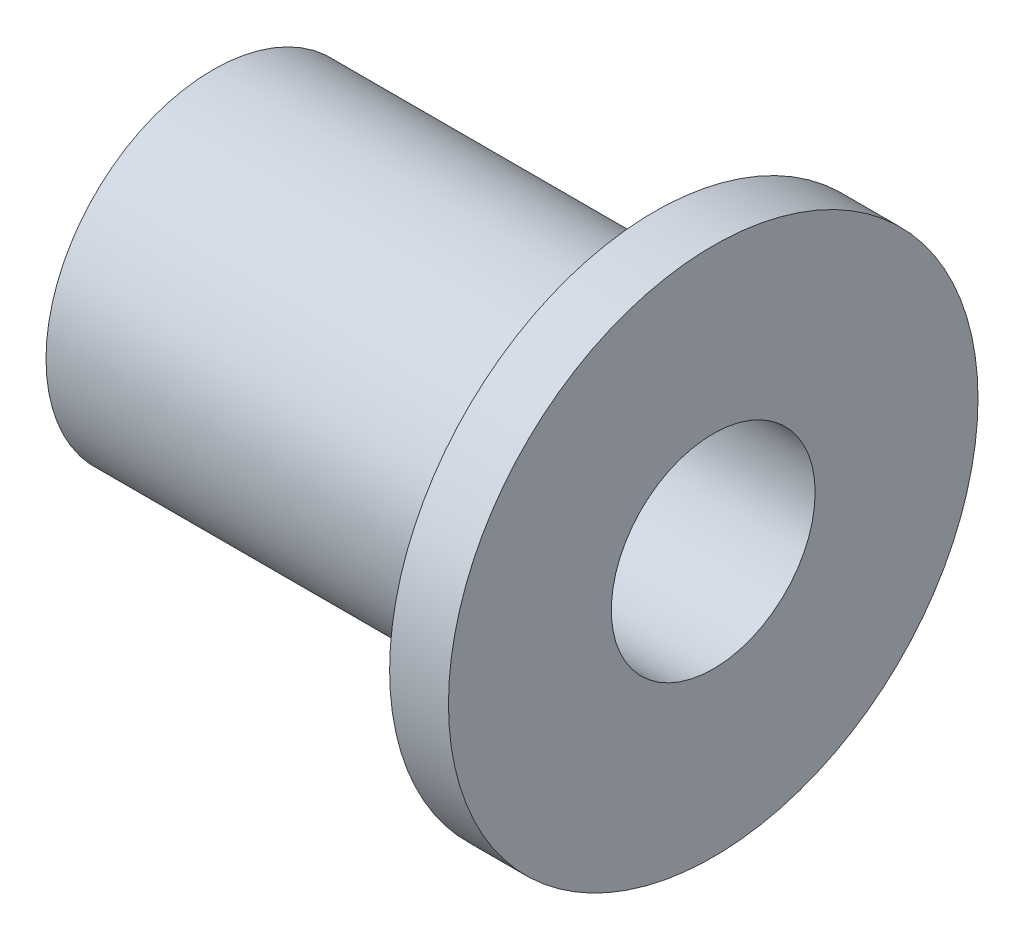
ISO-10303-21;
HEADER;
FILE_DESCRIPTION(('STEP AP214'),'2;1');
FILE_NAME('part.step','',(''),(''),'','','');
FILE_SCHEMA(('AUTOMOTIVE_DESIGN { 1 0 10303 214 1 1 1 1 }'));
ENDSEC;
DATA;
#1=APPLICATION_CONTEXT('core data for automotive mechanical design processes');
#2=APPLICATION_PROTOCOL_DEFINITION('international standard','automotive_design',2000,#1);
#3=PRODUCT_CONTEXT('',#1,'mechanical');
#4=PRODUCT('Part','Part','',(#3));
#5=PRODUCT_RELATED_PRODUCT_CATEGORY('part','',(#4));
#6=PRODUCT_DEFINITION_FORMATION('','',#4);
#7=PRODUCT_DEFINITION_CONTEXT('part definition',#1,'design');
#8=PRODUCT_DEFINITION('design','',#6,#7);
#9=PRODUCT_DEFINITION_SHAPE('','',#8);
#10=(LENGTH_UNIT() NAMED_UNIT(*) SI_UNIT(.MILLI.,.METRE.));
#11=(NAMED_UNIT(*) PLANE_ANGLE_UNIT() SI_UNIT($,.RADIAN.));
#12=(NAMED_UNIT(*) SI_UNIT($,.STERADIAN.) SOLID_ANGLE_UNIT());
#13=UNCERTAINTY_MEASURE_WITH_UNIT(LENGTH_MEASURE(1.E-05),#10,'distance_accuracy_value','');
#14=(GEOMETRIC_REPRESENTATION_CONTEXT(3) GLOBAL_UNCERTAINTY_ASSIGNED_CONTEXT((#13)) GLOBAL_UNIT_ASSIGNED_CONTEXT((#10,
#11,#12)) REPRESENTATION_CONTEXT('',''));
#15=CARTESIAN_POINT('',(0.,0.,0.));
#16=DIRECTION('',(0.,0.,1.));
#17=DIRECTION('',(1.,0.,0.));
#18=AXIS2_PLACEMENT_3D('',#15,#16,#17);
#19=CARTESIAN_POINT('',(3.96875,0.,0.));
#20=DIRECTION('',(-1.,0.,0.));
#21=DIRECTION('',(0.,0.,1.));
#22=AXIS2_PLACEMENT_3D('',#19,#20,#21);
#23=CYLINDRICAL_SURFACE('',#22,4.5085);
#24=CARTESIAN_POINT('',(-9.525,0.,0.));
#25=DIRECTION('',(-1.,0.,0.));
#26=DIRECTION('',(0.,0.,1.));
#27=AXIS2_PLACEMENT_3D('',#24,#25,#26);
#28=CIRCLE('',#27,4.5085);
#29=CARTESIAN_POINT('',(-9.525,0.,4.5085));
#30=VERTEX_POINT('',#29);
#31=EDGE_CURVE('E54',#30,#30,#28,.T.);
#32=ORIENTED_EDGE('',*,*,#31,.F.);
#33=EDGE_LOOP('',(#32));
#34=FACE_BOUND('',#33,.T.);
#35=CARTESIAN_POINT('',(2.38125,0.,0.));
#36=DIRECTION('',(1.,0.,0.));
#37=DIRECTION('',(0.,0.,-1.));
#38=AXIS2_PLACEMENT_3D('',#35,#36,#37);
#39=CIRCLE('',#38,4.5085);
#40=CARTESIAN_POINT('',(2.38125,0.,-4.5085));
#41=VERTEX_POINT('',#40);
#42=EDGE_CURVE('E10',#41,#41,#39,.T.);
#43=ORIENTED_EDGE('',*,*,#42,.F.);
#44=EDGE_LOOP('',(#43));
#45=FACE_BOUND('',#44,.T.);
#46=ADVANCED_FACE('F39',(#34,#45),#23,.T.);
#47=CARTESIAN_POINT('',(0.,0.,0.));
#48=DIRECTION('',(1.,0.,0.));
#49=DIRECTION('',(0.,0.,-1.));
#50=AXIS2_PLACEMENT_3D('',#47,#48,#49);
#51=PLANE('',#50);
#52=CARTESIAN_POINT('',(0.,0.,0.));
#53=DIRECTION('',(1.,0.,0.));
#54=DIRECTION('',(0.,0.,-1.));
#55=AXIS2_PLACEMENT_3D('',#52,#53,#54);
#56=CIRCLE('',#55,2.75);
#57=CARTESIAN_POINT('',(0.,0.,-2.75));
#58=VERTEX_POINT('',#57);
#59=EDGE_CURVE('E49',#58,#58,#56,.T.);
#60=ORIENTED_EDGE('',*,*,#59,.T.);
#61=EDGE_LOOP('',(#60));
#62=FACE_BOUND('',#61,.T.);
#63=CARTESIAN_POINT('',(0.,0.,0.));
#64=DIRECTION('',(-1.,0.,0.));
#65=DIRECTION('',(0.,0.,1.));
#66=AXIS2_PLACEMENT_3D('',#63,#64,#65);
#67=CIRCLE('',#66,3.96875);
#68=CARTESIAN_POINT('',(0.,0.,-3.96875));
#69=VERTEX_POINT('',#68);
#70=EDGE_CURVE('E59',#69,#69,#67,.T.);
#71=ORIENTED_EDGE('',*,*,#70,.T.);
#72=EDGE_LOOP('',(#71));
#73=FACE_BOUND('',#72,.T.);
#74=ADVANCED_FACE('F83',(#62,#73),#51,.F.);
#75=CARTESIAN_POINT('',(3.96875,0.,0.));
#76=DIRECTION('',(1.,0.,0.));
#77=DIRECTION('',(0.,0.,-1.));
#78=AXIS2_PLACEMENT_3D('',#75,#76,#77);
#79=PLANE('',#78);
#80=CARTESIAN_POINT('',(3.96875,0.,0.));
#81=DIRECTION('',(1.,0.,0.));
#82=DIRECTION('',(0.,0.,-1.));
#83=AXIS2_PLACEMENT_3D('',#80,#81,#82);
#84=CIRCLE('',#83,2.75);
#85=CARTESIAN_POINT('',(3.96875,0.,-2.75));
#86=VERTEX_POINT('',#85);
#87=EDGE_CURVE('E45',#86,#86,#84,.T.);
#88=ORIENTED_EDGE('',*,*,#87,.F.);
#89=EDGE_LOOP('',(#88));
#90=FACE_BOUND('',#89,.T.);
#91=CARTESIAN_POINT('',(3.96875,0.,0.));
#92=DIRECTION('',(1.,0.,0.));
#93=DIRECTION('',(0.,0.,-1.));
#94=AXIS2_PLACEMENT_3D('',#91,#92,#93);
#95=CIRCLE('',#94,7.14375);
#96=CARTESIAN_POINT('',(3.96875,0.,-7.14375));
#97=VERTEX_POINT('',#96);
#98=EDGE_CURVE('E65',#97,#97,#95,.T.);
#99=ORIENTED_EDGE('',*,*,#98,.T.);
#100=EDGE_LOOP('',(#99));
#101=FACE_BOUND('',#100,.T.);
#102=ADVANCED_FACE('F90',(#90,#101),#79,.T.);
#103=CARTESIAN_POINT('',(3.96875,0.,0.));
#104=DIRECTION('',(-1.,0.,0.));
#105=DIRECTION('',(0.,0.,1.));
#106=AXIS2_PLACEMENT_3D('',#103,#104,#105);
#107=CYLINDRICAL_SURFACE('',#106,2.75);
#108=ORIENTED_EDGE('',*,*,#87,.T.);
#109=EDGE_LOOP('',(#108));
#110=FACE_BOUND('',#109,.T.);
#111=ORIENTED_EDGE('',*,*,#59,.F.);
#112=EDGE_LOOP('',(#111));
#113=FACE_BOUND('',#112,.T.);
#114=ADVANCED_FACE('F98',(#110,#113),#107,.F.);
#115=CARTESIAN_POINT('',(-9.525,0.,0.));
#116=DIRECTION('',(-1.,0.,0.));
#117=DIRECTION('',(0.,0.,1.));
#118=AXIS2_PLACEMENT_3D('',#115,#116,#117);
#119=PLANE('',#118);
#120=ORIENTED_EDGE('',*,*,#31,.T.);
#121=EDGE_LOOP('',(#120));
#122=FACE_BOUND('',#121,.T.);
#123=CARTESIAN_POINT('',(-9.525,0.,0.));
#124=DIRECTION('',(-1.,0.,0.));
#125=DIRECTION('',(0.,0.,1.));
#126=AXIS2_PLACEMENT_3D('',#123,#124,#125);
#127=CIRCLE('',#126,3.96875);
#128=CARTESIAN_POINT('',(-9.525,0.,-3.96875));
#129=VERTEX_POINT('',#128);
#130=EDGE_CURVE('E58',#129,#129,#127,.T.);
#131=ORIENTED_EDGE('',*,*,#130,.F.);
#132=EDGE_LOOP('',(#131));
#133=FACE_BOUND('',#132,.T.);
#134=ADVANCED_FACE('F95',(#122,#133),#119,.T.);
#135=CARTESIAN_POINT('',(-9.525,0.,0.));
#136=DIRECTION('',(1.,0.,0.));
#137=DIRECTION('',(0.,0.,-1.));
#138=AXIS2_PLACEMENT_3D('',#135,#136,#137);
#139=CYLINDRICAL_SURFACE('',#138,3.96875);
#140=CARTESIAN_POINT('',(-9.525,0.,-3.96875));
#141=CARTESIAN_POINT('',(-9.42578125,0.,-3.96875));
#142=CARTESIAN_POINT('',(-9.3265625,0.,-3.96875));
#143=CARTESIAN_POINT('',(-9.128125,0.,-3.96875));
#144=CARTESIAN_POINT('',(-9.02890625,0.,-3.96875));
#145=CARTESIAN_POINT('',(-8.83046875,0.,-3.96875));
#146=CARTESIAN_POINT('',(-8.73125,0.,-3.96875));
#147=CARTESIAN_POINT('',(-8.5328125,0.,-3.96875));
#148=CARTESIAN_POINT('',(-8.43359375,0.,-3.96875));
#149=CARTESIAN_POINT('',(-8.23515625,0.,-3.96875));
#150=CARTESIAN_POINT('',(-8.1359375,0.,-3.96875));
#151=CARTESIAN_POINT('',(-7.9375,0.,-3.96875));
#152=CARTESIAN_POINT('',(-7.83828125,0.,-3.96875));
#153=CARTESIAN_POINT('',(-7.63984375,0.,-3.96875));
#154=CARTESIAN_POINT('',(-7.540625,0.,-3.96875));
#155=CARTESIAN_POINT('',(-7.3421875,0.,-3.96875));
#156=CARTESIAN_POINT('',(-7.24296875,0.,-3.96875));
#157=CARTESIAN_POINT('',(-7.04453125,0.,-3.96875));
#158=CARTESIAN_POINT('',(-6.9453125,0.,-3.96875));
#159=CARTESIAN_POINT('',(-6.746875,0.,-3.96875));
#160=CARTESIAN_POINT('',(-6.64765625,0.,-3.96875));
#161=CARTESIAN_POINT('',(-6.44921875,0.,-3.96875));
#162=CARTESIAN_POINT('',(-6.35,0.,-3.96875));
#163=CARTESIAN_POINT('',(-6.1515625,0.,-3.96875));
#164=CARTESIAN_POINT('',(-6.05234375,0.,-3.96875));
#165=CARTESIAN_POINT('',(-5.85390625,0.,-3.96875));
#166=CARTESIAN_POINT('',(-5.7546875,0.,-3.96875));
#167=CARTESIAN_POINT('',(-5.55625,0.,-3.96875));
#168=CARTESIAN_POINT('',(-5.45703125,0.,-3.96875));
#169=CARTESIAN_POINT('',(-5.25859375,0.,-3.96875));
#170=CARTESIAN_POINT('',(-5.159375,0.,-3.96875));
#171=CARTESIAN_POINT('',(-4.9609375,0.,-3.96875));
#172=CARTESIAN_POINT('',(-4.86171875,0.,-3.96875));
#173=CARTESIAN_POINT('',(-4.66328125,0.,-3.96875));
#174=CARTESIAN_POINT('',(-4.5640625,0.,-3.96875));
#175=CARTESIAN_POINT('',(-4.365625,0.,-3.96875));
#176=CARTESIAN_POINT('',(-4.26640625,0.,-3.96875));
#177=CARTESIAN_POINT('',(-4.06796875,0.,-3.96875));
#178=CARTESIAN_POINT('',(-3.96875,0.,-3.96875));
#179=CARTESIAN_POINT('',(-3.7703125,0.,-3.96875));
#180=CARTESIAN_POINT('',(-3.67109375,0.,-3.96875));
#181=CARTESIAN_POINT('',(-3.47265625,0.,-3.96875));
#182=CARTESIAN_POINT('',(-3.3734375,0.,-3.96875));
#183=CARTESIAN_POINT('',(-3.175,0.,-3.96875));
#184=CARTESIAN_POINT('',(-3.07578125,0.,-3.96875));
#185=CARTESIAN_POINT('',(-2.87734375,0.,-3.96875));
#186=CARTESIAN_POINT('',(-2.778125,0.,-3.96875));
#187=CARTESIAN_POINT('',(-2.5796875,0.,-3.96875));
#188=CARTESIAN_POINT('',(-2.48046875,0.,-3.96875));
#189=CARTESIAN_POINT('',(-2.28203125,0.,-3.96875));
#190=CARTESIAN_POINT('',(-2.1828125,0.,-3.96875));
#191=CARTESIAN_POINT('',(-1.984375,0.,-3.96875));
#192=CARTESIAN_POINT('',(-1.88515625,0.,-3.96875));
#193=CARTESIAN_POINT('',(-1.68671875,0.,-3.96875));
#194=CARTESIAN_POINT('',(-1.5875,0.,-3.96875));
#195=CARTESIAN_POINT('',(-1.3890625,0.,-3.96875));
#196=CARTESIAN_POINT('',(-1.28984375,0.,-3.96875));
#197=CARTESIAN_POINT('',(-1.09140625,0.,-3.96875));
#198=CARTESIAN_POINT('',(-0.992187500000001,0.,-3.96875));
#199=CARTESIAN_POINT('',(-0.793750000000001,0.,-3.96875));
#200=CARTESIAN_POINT('',(-0.69453125,0.,-3.96875));
#201=CARTESIAN_POINT('',(-0.49609375,0.,-3.96875));
#202=CARTESIAN_POINT('',(-0.396875,0.,-3.96875));
#203=CARTESIAN_POINT('',(-0.1984375,0.,-3.96875));
#204=CARTESIAN_POINT('',(-0.0992187500000001,0.,-3.96875));
#205=CARTESIAN_POINT('',(0.,0.,-3.96875));
#206=B_SPLINE_CURVE_WITH_KNOTS('',3,(#140,#141,#142,#143,#144,#145,#146,#147,#148,#149,#150,
#151,#152,#153,#154,#155,#156,#157,#158,#159,#160,#161,#162,#163,#164,#165,#166,#167,#168,#169,
#170,#171,#172,#173,#174,#175,#176,#177,#178,#179,#180,#181,#182,#183,#184,#185,#186,#187,#188,
#189,#190,#191,#192,#193,#194,#195,#196,#197,#198,#199,#200,#201,#202,#203,#204,#205),
.UNSPECIFIED.,.F.,.F.,(4,2,2,2,2,2,2,2,2,2,2,2,2,2,2,2,2,2,2,2,2,2,2,2,2,2,2,2,2,2,2,2,4),(0.,
0.297656249999998,0.595312499999999,0.892968749999999,1.190625,1.48828125,1.7859375,2.08359375,
2.38125,2.67890625,2.9765625,3.27421875,3.571875,3.86953125,4.1671875,4.46484375,4.7625,
5.06015625,5.3578125,5.65546875,5.953125,6.25078125,6.5484375,6.84609375,7.14375,7.44140625,
7.7390625,8.03671875,8.334375,8.63203125,8.9296875,9.22734375,9.525),.UNSPECIFIED.);
#207=EDGE_CURVE('BSEAM80',#129,#69,#206,.T.);
#208=ORIENTED_EDGE('',*,*,#130,.T.);
#209=ORIENTED_EDGE('',*,*,#70,.F.);
#210=ORIENTED_EDGE('',*,*,#207,.T.);
#211=ORIENTED_EDGE('',*,*,#207,.F.);
#212=EDGE_LOOP('',(#208,#210,#209,#211));
#213=FACE_BOUND('',#212,.T.);
#214=ADVANCED_FACE('F80',(#213),#139,.F.);
#215=CARTESIAN_POINT('',(2.38125,0.,0.));
#216=DIRECTION('',(1.,0.,0.));
#217=DIRECTION('',(0.,0.,-1.));
#218=AXIS2_PLACEMENT_3D('',#215,#216,#217);
#219=CYLINDRICAL_SURFACE('',#218,7.14375);
#220=CARTESIAN_POINT('',(2.38125,0.,0.));
#221=DIRECTION('',(1.,0.,0.));
#222=DIRECTION('',(0.,0.,-1.));
#223=AXIS2_PLACEMENT_3D('',#220,#221,#222);
#224=CIRCLE('',#223,7.14375);
#225=CARTESIAN_POINT('',(2.38125,0.,-7.14375));
#226=VERTEX_POINT('',#225);
#227=EDGE_CURVE('E62',#226,#226,#224,.T.);
#228=ORIENTED_EDGE('',*,*,#227,.T.);
#229=EDGE_LOOP('',(#228));
#230=FACE_BOUND('',#229,.T.);
#231=ORIENTED_EDGE('',*,*,#98,.F.);
#232=EDGE_LOOP('',(#231));
#233=FACE_BOUND('',#232,.T.);
#234=ADVANCED_FACE('F71',(#230,#233),#219,.T.);
#235=CARTESIAN_POINT('',(2.38125,0.,0.));
#236=DIRECTION('',(1.,0.,0.));
#237=DIRECTION('',(0.,0.,-1.));
#238=AXIS2_PLACEMENT_3D('',#235,#236,#237);
#239=PLANE('',#238);
#240=ORIENTED_EDGE('',*,*,#42,.T.);
#241=EDGE_LOOP('',(#240));
#242=FACE_BOUND('',#241,.T.);
#243=ORIENTED_EDGE('',*,*,#227,.F.);
#244=EDGE_LOOP('',(#243));
#245=FACE_BOUND('',#244,.T.);
#246=ADVANCED_FACE('F74',(#242,#245),#239,.F.);
#247=CLOSED_SHELL('',(#46,#74,#102,#114,#134,#214,#234,#246));
#248=MANIFOLD_SOLID_BREP('B2',#247);
#249=ADVANCED_BREP_SHAPE_REPRESENTATION('',(#18,#248),#14);
#250=SHAPE_DEFINITION_REPRESENTATION(#9,#249);
ENDSEC;
END-ISO-10303-21;
